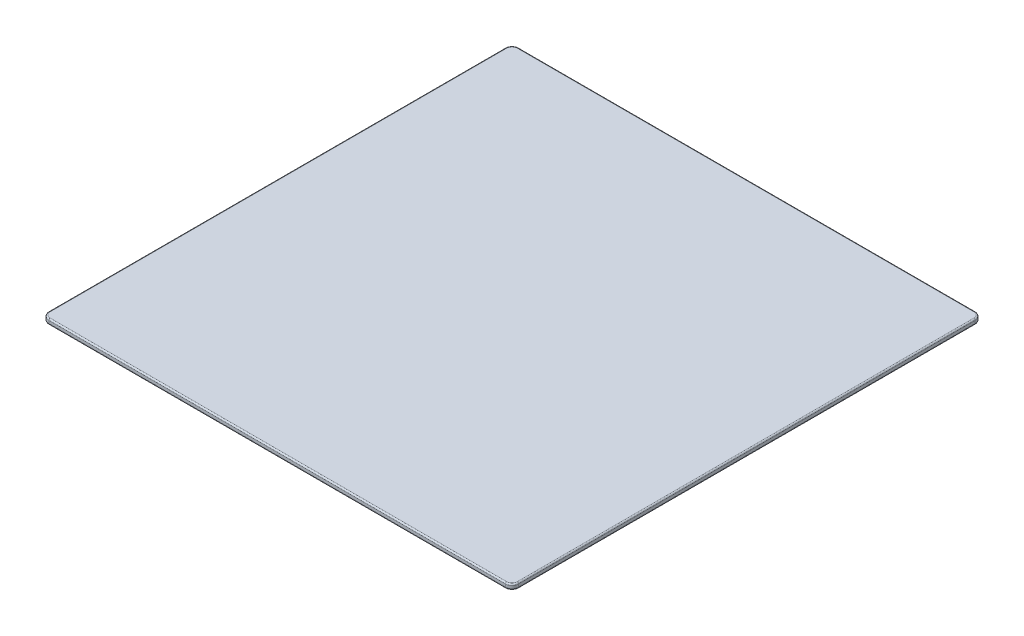
ISO-10303-21;
HEADER;
FILE_DESCRIPTION(('STEP AP214'),'2;1');
FILE_NAME('part.step','',(''),(''),'','','');
FILE_SCHEMA(('AUTOMOTIVE_DESIGN { 1 0 10303 214 1 1 1 1 }'));
ENDSEC;
DATA;
#1=APPLICATION_CONTEXT('core data for automotive mechanical design processes');
#2=APPLICATION_PROTOCOL_DEFINITION('international standard','automotive_design',2000,#1);
#3=PRODUCT_CONTEXT('',#1,'mechanical');
#4=PRODUCT('Part','Part','',(#3));
#5=PRODUCT_RELATED_PRODUCT_CATEGORY('part','',(#4));
#6=PRODUCT_DEFINITION_FORMATION('','',#4);
#7=PRODUCT_DEFINITION_CONTEXT('part definition',#1,'design');
#8=PRODUCT_DEFINITION('design','',#6,#7);
#9=PRODUCT_DEFINITION_SHAPE('','',#8);
#10=(LENGTH_UNIT() NAMED_UNIT(*) SI_UNIT(.MILLI.,.METRE.));
#11=(NAMED_UNIT(*) PLANE_ANGLE_UNIT() SI_UNIT($,.RADIAN.));
#12=(NAMED_UNIT(*) SI_UNIT($,.STERADIAN.) SOLID_ANGLE_UNIT());
#13=UNCERTAINTY_MEASURE_WITH_UNIT(LENGTH_MEASURE(1.E-05),#10,'distance_accuracy_value','');
#14=(GEOMETRIC_REPRESENTATION_CONTEXT(3) GLOBAL_UNCERTAINTY_ASSIGNED_CONTEXT((#13)) GLOBAL_UNIT_ASSIGNED_CONTEXT((#10,
#11,#12)) REPRESENTATION_CONTEXT('',''));
#15=CARTESIAN_POINT('',(0.,0.,0.));
#16=DIRECTION('',(0.,0.,1.));
#17=DIRECTION('',(1.,0.,0.));
#18=AXIS2_PLACEMENT_3D('',#15,#16,#17);
#19=CARTESIAN_POINT('',(170.,4.,170.));
#20=DIRECTION('',(0.,-1.,0.));
#21=DIRECTION('',(0.,0.,-1.));
#22=AXIS2_PLACEMENT_3D('',#19,#20,#21);
#23=CYLINDRICAL_SURFACE('',#22,5.00000000000006);
#24=DIRECTION('',(0.,-1.,0.));
#25=VECTOR('',#24,1.);
#26=CARTESIAN_POINT('',(170.,4.,175.));
#27=LINE('',#26,#25);
#28=CARTESIAN_POINT('',(170.,3.,175.));
#29=VERTEX_POINT('',#28);
#30=CARTESIAN_POINT('',(170.,1.,175.));
#31=VERTEX_POINT('',#30);
#32=EDGE_CURVE('E314',#29,#31,#27,.T.);
#33=ORIENTED_EDGE('',*,*,#32,.T.);
#34=CARTESIAN_POINT('',(170.,1.,170.));
#35=DIRECTION('',(0.,1.,0.));
#36=DIRECTION('',(0.,0.,1.));
#37=AXIS2_PLACEMENT_3D('',#34,#35,#36);
#38=CIRCLE('',#37,5.00000000000006);
#39=CARTESIAN_POINT('',(175.,1.,170.));
#40=VERTEX_POINT('',#39);
#41=EDGE_CURVE('E263',#31,#40,#38,.T.);
#42=ORIENTED_EDGE('',*,*,#41,.T.);
#43=DIRECTION('',(0.,-1.,0.));
#44=VECTOR('',#43,1.);
#45=CARTESIAN_POINT('',(175.,4.,170.));
#46=LINE('',#45,#44);
#47=CARTESIAN_POINT('',(175.,3.,170.));
#48=VERTEX_POINT('',#47);
#49=EDGE_CURVE('E178',#48,#40,#46,.T.);
#50=ORIENTED_EDGE('',*,*,#49,.F.);
#51=CARTESIAN_POINT('',(170.,3.,170.));
#52=DIRECTION('',(0.,1.,0.));
#53=DIRECTION('',(0.,0.,1.));
#54=AXIS2_PLACEMENT_3D('',#51,#52,#53);
#55=CIRCLE('',#54,5.00000000000006);
#56=EDGE_CURVE('E260',#48,#29,#55,.F.);
#57=ORIENTED_EDGE('',*,*,#56,.T.);
#58=EDGE_LOOP('',(#33,#42,#50,#57));
#59=FACE_BOUND('',#58,.T.);
#60=ADVANCED_FACE('F39',(#59),#23,.T.);
#61=CARTESIAN_POINT('',(175.,4.,-170.));
#62=DIRECTION('',(-1.,0.,0.));
#63=DIRECTION('',(0.,0.,1.));
#64=AXIS2_PLACEMENT_3D('',#61,#62,#63);
#65=PLANE('',#64);
#66=ORIENTED_EDGE('',*,*,#49,.T.);
#67=DIRECTION('',(0.,0.,-1.));
#68=VECTOR('',#67,1.);
#69=CARTESIAN_POINT('',(175.,1.,-170.));
#70=LINE('',#69,#68);
#71=CARTESIAN_POINT('',(175.,1.,-170.));
#72=VERTEX_POINT('',#71);
#73=EDGE_CURVE('E176',#40,#72,#70,.T.);
#74=ORIENTED_EDGE('',*,*,#73,.T.);
#75=DIRECTION('',(0.,-1.,0.));
#76=VECTOR('',#75,1.);
#77=CARTESIAN_POINT('',(175.,4.,-170.));
#78=LINE('',#77,#76);
#79=CARTESIAN_POINT('',(175.,3.,-170.));
#80=VERTEX_POINT('',#79);
#81=EDGE_CURVE('E157',#80,#72,#78,.T.);
#82=ORIENTED_EDGE('',*,*,#81,.F.);
#83=DIRECTION('',(0.,0.,-1.));
#84=VECTOR('',#83,1.);
#85=CARTESIAN_POINT('',(175.,3.,170.));
#86=LINE('',#85,#84);
#87=EDGE_CURVE('E173',#80,#48,#86,.F.);
#88=ORIENTED_EDGE('',*,*,#87,.T.);
#89=EDGE_LOOP('',(#66,#74,#82,#88));
#90=FACE_BOUND('',#89,.T.);
#91=ADVANCED_FACE('F171',(#90),#65,.F.);
#92=CARTESIAN_POINT('',(170.,4.,-170.));
#93=DIRECTION('',(0.,-1.,0.));
#94=DIRECTION('',(0.,0.,-1.));
#95=AXIS2_PLACEMENT_3D('',#92,#93,#94);
#96=CYLINDRICAL_SURFACE('',#95,5.00000000000002);
#97=ORIENTED_EDGE('',*,*,#81,.T.);
#98=CARTESIAN_POINT('',(170.,1.,-170.));
#99=DIRECTION('',(0.,1.,0.));
#100=DIRECTION('',(0.,0.,1.));
#101=AXIS2_PLACEMENT_3D('',#98,#99,#100);
#102=CIRCLE('',#101,5.00000000000002);
#103=CARTESIAN_POINT('',(170.,1.,-175.));
#104=VERTEX_POINT('',#103);
#105=EDGE_CURVE('E165',#72,#104,#102,.T.);
#106=ORIENTED_EDGE('',*,*,#105,.T.);
#107=DIRECTION('',(0.,-1.,0.));
#108=VECTOR('',#107,1.);
#109=CARTESIAN_POINT('',(170.,4.,-175.));
#110=LINE('',#109,#108);
#111=CARTESIAN_POINT('',(170.,3.,-175.));
#112=VERTEX_POINT('',#111);
#113=EDGE_CURVE('E159',#112,#104,#110,.T.);
#114=ORIENTED_EDGE('',*,*,#113,.F.);
#115=CARTESIAN_POINT('',(170.,3.,-170.));
#116=DIRECTION('',(0.,1.,0.));
#117=DIRECTION('',(0.,0.,1.));
#118=AXIS2_PLACEMENT_3D('',#115,#116,#117);
#119=CIRCLE('',#118,5.00000000000002);
#120=EDGE_CURVE('E154',#112,#80,#119,.F.);
#121=ORIENTED_EDGE('',*,*,#120,.T.);
#122=EDGE_LOOP('',(#97,#106,#114,#121));
#123=FACE_BOUND('',#122,.T.);
#124=ADVANCED_FACE('F156',(#123),#96,.T.);
#125=CARTESIAN_POINT('',(-170.,4.,-175.));
#126=DIRECTION('',(0.,0.,1.));
#127=DIRECTION('',(1.,0.,0.));
#128=AXIS2_PLACEMENT_3D('',#125,#126,#127);
#129=PLANE('',#128);
#130=ORIENTED_EDGE('',*,*,#113,.T.);
#131=DIRECTION('',(-1.,0.,0.));
#132=VECTOR('',#131,1.);
#133=CARTESIAN_POINT('',(-170.,1.,-175.));
#134=LINE('',#133,#132);
#135=CARTESIAN_POINT('',(-170.,1.,-175.));
#136=VERTEX_POINT('',#135);
#137=EDGE_CURVE('E232',#104,#136,#134,.T.);
#138=ORIENTED_EDGE('',*,*,#137,.T.);
#139=DIRECTION('',(0.,-1.,0.));
#140=VECTOR('',#139,1.);
#141=CARTESIAN_POINT('',(-170.,4.,-175.));
#142=LINE('',#141,#140);
#143=CARTESIAN_POINT('',(-170.,3.,-175.));
#144=VERTEX_POINT('',#143);
#145=EDGE_CURVE('E346',#144,#136,#142,.T.);
#146=ORIENTED_EDGE('',*,*,#145,.F.);
#147=DIRECTION('',(-1.,0.,0.));
#148=VECTOR('',#147,1.);
#149=CARTESIAN_POINT('',(170.,3.,-175.));
#150=LINE('',#149,#148);
#151=EDGE_CURVE('E229',#144,#112,#150,.F.);
#152=ORIENTED_EDGE('',*,*,#151,.T.);
#153=EDGE_LOOP('',(#130,#138,#146,#152));
#154=FACE_BOUND('',#153,.T.);
#155=ADVANCED_FACE('F343',(#154),#129,.F.);
#156=CARTESIAN_POINT('',(-170.,4.,-170.));
#157=DIRECTION('',(0.,-1.,0.));
#158=DIRECTION('',(0.,0.,-1.));
#159=AXIS2_PLACEMENT_3D('',#156,#157,#158);
#160=CYLINDRICAL_SURFACE('',#159,5.);
#161=ORIENTED_EDGE('',*,*,#145,.T.);
#162=CARTESIAN_POINT('',(-170.,1.,-170.));
#163=DIRECTION('',(0.,1.,0.));
#164=DIRECTION('',(0.,0.,1.));
#165=AXIS2_PLACEMENT_3D('',#162,#163,#164);
#166=CIRCLE('',#165,5.);
#167=CARTESIAN_POINT('',(-175.,1.,-170.));
#168=VERTEX_POINT('',#167);
#169=EDGE_CURVE('E238',#136,#168,#166,.T.);
#170=ORIENTED_EDGE('',*,*,#169,.T.);
#171=DIRECTION('',(0.,-1.,0.));
#172=VECTOR('',#171,1.);
#173=CARTESIAN_POINT('',(-175.,4.,-170.));
#174=LINE('',#173,#172);
#175=CARTESIAN_POINT('',(-175.,3.,-170.));
#176=VERTEX_POINT('',#175);
#177=EDGE_CURVE('E350',#176,#168,#174,.T.);
#178=ORIENTED_EDGE('',*,*,#177,.F.);
#179=CARTESIAN_POINT('',(-170.,3.,-170.));
#180=DIRECTION('',(0.,1.,0.));
#181=DIRECTION('',(0.,0.,1.));
#182=AXIS2_PLACEMENT_3D('',#179,#180,#181);
#183=CIRCLE('',#182,5.);
#184=EDGE_CURVE('E235',#176,#144,#183,.F.);
#185=ORIENTED_EDGE('',*,*,#184,.T.);
#186=EDGE_LOOP('',(#161,#170,#178,#185));
#187=FACE_BOUND('',#186,.T.);
#188=ADVANCED_FACE('F400',(#187),#160,.T.);
#189=CARTESIAN_POINT('',(-175.,4.,-170.));
#190=DIRECTION('',(1.,0.,0.));
#191=DIRECTION('',(0.,0.,-1.));
#192=AXIS2_PLACEMENT_3D('',#189,#190,#191);
#193=PLANE('',#192);
#194=ORIENTED_EDGE('',*,*,#177,.T.);
#195=DIRECTION('',(0.,0.,1.));
#196=VECTOR('',#195,1.);
#197=CARTESIAN_POINT('',(-175.,1.,-170.));
#198=LINE('',#197,#196);
#199=CARTESIAN_POINT('',(-175.,1.,170.));
#200=VERTEX_POINT('',#199);
#201=EDGE_CURVE('E244',#168,#200,#198,.T.);
#202=ORIENTED_EDGE('',*,*,#201,.T.);
#203=DIRECTION('',(0.,-1.,0.));
#204=VECTOR('',#203,1.);
#205=CARTESIAN_POINT('',(-175.,4.,170.));
#206=LINE('',#205,#204);
#207=CARTESIAN_POINT('',(-175.,3.,170.));
#208=VERTEX_POINT('',#207);
#209=EDGE_CURVE('E356',#208,#200,#206,.T.);
#210=ORIENTED_EDGE('',*,*,#209,.F.);
#211=DIRECTION('',(0.,0.,1.));
#212=VECTOR('',#211,1.);
#213=CARTESIAN_POINT('',(-175.,3.,-170.));
#214=LINE('',#213,#212);
#215=EDGE_CURVE('E241',#208,#176,#214,.F.);
#216=ORIENTED_EDGE('',*,*,#215,.T.);
#217=EDGE_LOOP('',(#194,#202,#210,#216));
#218=FACE_BOUND('',#217,.T.);
#219=ADVANCED_FACE('F403',(#218),#193,.F.);
#220=CARTESIAN_POINT('',(-170.,4.,170.));
#221=DIRECTION('',(0.,-1.,0.));
#222=DIRECTION('',(0.,0.,-1.));
#223=AXIS2_PLACEMENT_3D('',#220,#221,#222);
#224=CYLINDRICAL_SURFACE('',#223,5.00000000000002);
#225=ORIENTED_EDGE('',*,*,#209,.T.);
#226=CARTESIAN_POINT('',(-170.,1.,170.));
#227=DIRECTION('',(0.,1.,0.));
#228=DIRECTION('',(0.,0.,1.));
#229=AXIS2_PLACEMENT_3D('',#226,#227,#228);
#230=CIRCLE('',#229,5.00000000000002);
#231=CARTESIAN_POINT('',(-170.,1.,175.));
#232=VERTEX_POINT('',#231);
#233=EDGE_CURVE('E250',#200,#232,#230,.T.);
#234=ORIENTED_EDGE('',*,*,#233,.T.);
#235=DIRECTION('',(0.,-1.,0.));
#236=VECTOR('',#235,1.);
#237=CARTESIAN_POINT('',(-170.,4.,175.));
#238=LINE('',#237,#236);
#239=CARTESIAN_POINT('',(-170.,3.,175.));
#240=VERTEX_POINT('',#239);
#241=EDGE_CURVE('E362',#240,#232,#238,.T.);
#242=ORIENTED_EDGE('',*,*,#241,.F.);
#243=CARTESIAN_POINT('',(-170.,3.,170.));
#244=DIRECTION('',(0.,1.,0.));
#245=DIRECTION('',(0.,0.,1.));
#246=AXIS2_PLACEMENT_3D('',#243,#244,#245);
#247=CIRCLE('',#246,5.00000000000002);
#248=EDGE_CURVE('E247',#240,#208,#247,.F.);
#249=ORIENTED_EDGE('',*,*,#248,.T.);
#250=EDGE_LOOP('',(#225,#234,#242,#249));
#251=FACE_BOUND('',#250,.T.);
#252=ADVANCED_FACE('F417',(#251),#224,.T.);
#253=CARTESIAN_POINT('',(-170.,4.,175.));
#254=DIRECTION('',(0.,0.,-1.));
#255=DIRECTION('',(-1.,0.,0.));
#256=AXIS2_PLACEMENT_3D('',#253,#254,#255);
#257=PLANE('',#256);
#258=ORIENTED_EDGE('',*,*,#241,.T.);
#259=DIRECTION('',(1.,0.,0.));
#260=VECTOR('',#259,1.);
#261=CARTESIAN_POINT('',(-170.,1.,175.));
#262=LINE('',#261,#260);
#263=EDGE_CURVE('E257',#232,#31,#262,.T.);
#264=ORIENTED_EDGE('',*,*,#263,.T.);
#265=ORIENTED_EDGE('',*,*,#32,.F.);
#266=DIRECTION('',(1.,0.,0.));
#267=VECTOR('',#266,1.);
#268=CARTESIAN_POINT('',(-170.,3.,175.));
#269=LINE('',#268,#267);
#270=EDGE_CURVE('E253',#29,#240,#269,.F.);
#271=ORIENTED_EDGE('',*,*,#270,.T.);
#272=EDGE_LOOP('',(#258,#264,#265,#271));
#273=FACE_BOUND('',#272,.T.);
#274=ADVANCED_FACE('F418',(#273),#257,.F.);
#275=CARTESIAN_POINT('',(170.,4.,170.));
#276=DIRECTION('',(0.,1.,0.));
#277=DIRECTION('',(0.,0.,1.));
#278=AXIS2_PLACEMENT_3D('',#275,#276,#277);
#279=PLANE('',#278);
#280=CARTESIAN_POINT('',(-170.,4.,170.));
#281=DIRECTION('',(0.,1.,0.));
#282=DIRECTION('',(0.,0.,1.));
#283=AXIS2_PLACEMENT_3D('',#280,#281,#282);
#284=CIRCLE('',#283,4.00000000000002);
#285=CARTESIAN_POINT('',(-174.,4.,170.));
#286=VERTEX_POINT('',#285);
#287=CARTESIAN_POINT('',(-170.,4.,174.));
#288=VERTEX_POINT('',#287);
#289=EDGE_CURVE('E49',#286,#288,#284,.T.);
#290=ORIENTED_EDGE('',*,*,#289,.T.);
#291=DIRECTION('',(1.,0.,0.));
#292=VECTOR('',#291,1.);
#293=CARTESIAN_POINT('',(170.,4.,174.));
#294=LINE('',#293,#292);
#295=CARTESIAN_POINT('',(170.,4.,174.));
#296=VERTEX_POINT('',#295);
#297=EDGE_CURVE('E11',#288,#296,#294,.T.);
#298=ORIENTED_EDGE('',*,*,#297,.T.);
#299=CARTESIAN_POINT('',(170.,4.,170.));
#300=DIRECTION('',(0.,1.,0.));
#301=DIRECTION('',(0.,0.,1.));
#302=AXIS2_PLACEMENT_3D('',#299,#300,#301);
#303=CIRCLE('',#302,4.00000000000006);
#304=CARTESIAN_POINT('',(174.,4.,170.));
#305=VERTEX_POINT('',#304);
#306=EDGE_CURVE('E266',#296,#305,#303,.T.);
#307=ORIENTED_EDGE('',*,*,#306,.T.);
#308=DIRECTION('',(0.,0.,-1.));
#309=VECTOR('',#308,1.);
#310=CARTESIAN_POINT('',(174.,4.,-170.));
#311=LINE('',#310,#309);
#312=CARTESIAN_POINT('',(174.,4.,-170.));
#313=VERTEX_POINT('',#312);
#314=EDGE_CURVE('E269',#305,#313,#311,.T.);
#315=ORIENTED_EDGE('',*,*,#314,.T.);
#316=CARTESIAN_POINT('',(170.,4.,-170.));
#317=DIRECTION('',(0.,1.,0.));
#318=DIRECTION('',(0.,0.,1.));
#319=AXIS2_PLACEMENT_3D('',#316,#317,#318);
#320=CIRCLE('',#319,4.00000000000002);
#321=CARTESIAN_POINT('',(170.,4.,-174.));
#322=VERTEX_POINT('',#321);
#323=EDGE_CURVE('E184',#313,#322,#320,.T.);
#324=ORIENTED_EDGE('',*,*,#323,.T.);
#325=DIRECTION('',(-1.,0.,0.));
#326=VECTOR('',#325,1.);
#327=CARTESIAN_POINT('',(-170.,4.,-174.));
#328=LINE('',#327,#326);
#329=CARTESIAN_POINT('',(-170.,4.,-174.));
#330=VERTEX_POINT('',#329);
#331=EDGE_CURVE('E274',#322,#330,#328,.T.);
#332=ORIENTED_EDGE('',*,*,#331,.T.);
#333=CARTESIAN_POINT('',(-170.,4.,-170.));
#334=DIRECTION('',(0.,1.,0.));
#335=DIRECTION('',(0.,0.,1.));
#336=AXIS2_PLACEMENT_3D('',#333,#334,#335);
#337=CIRCLE('',#336,4.);
#338=CARTESIAN_POINT('',(-174.,4.,-170.));
#339=VERTEX_POINT('',#338);
#340=EDGE_CURVE('E277',#330,#339,#337,.T.);
#341=ORIENTED_EDGE('',*,*,#340,.T.);
#342=DIRECTION('',(0.,0.,1.));
#343=VECTOR('',#342,1.);
#344=CARTESIAN_POINT('',(-174.,4.,170.));
#345=LINE('',#344,#343);
#346=EDGE_CURVE('E60',#339,#286,#345,.T.);
#347=ORIENTED_EDGE('',*,*,#346,.T.);
#348=EDGE_LOOP('',(#290,#298,#307,#315,#324,#332,#341,#347));
#349=FACE_BOUND('',#348,.T.);
#350=ADVANCED_FACE('F427',(#349),#279,.T.);
#351=CARTESIAN_POINT('',(170.,0.,170.));
#352=DIRECTION('',(0.,1.,0.));
#353=DIRECTION('',(0.,0.,1.));
#354=AXIS2_PLACEMENT_3D('',#351,#352,#353);
#355=PLANE('',#354);
#356=CARTESIAN_POINT('',(170.,0.,-170.));
#357=DIRECTION('',(0.,1.,0.));
#358=DIRECTION('',(0.,0.,1.));
#359=AXIS2_PLACEMENT_3D('',#356,#357,#358);
#360=CIRCLE('',#359,4.00000000000002);
#361=CARTESIAN_POINT('',(170.,0.,-174.));
#362=VERTEX_POINT('',#361);
#363=CARTESIAN_POINT('',(174.,0.,-170.));
#364=VERTEX_POINT('',#363);
#365=EDGE_CURVE('E221',#362,#364,#360,.F.);
#366=ORIENTED_EDGE('',*,*,#365,.T.);
#367=DIRECTION('',(0.,0.,-1.));
#368=VECTOR('',#367,1.);
#369=CARTESIAN_POINT('',(174.,0.,170.));
#370=LINE('',#369,#368);
#371=CARTESIAN_POINT('',(174.,0.,170.));
#372=VERTEX_POINT('',#371);
#373=EDGE_CURVE('E166',#364,#372,#370,.F.);
#374=ORIENTED_EDGE('',*,*,#373,.T.);
#375=CARTESIAN_POINT('',(170.,0.,170.));
#376=DIRECTION('',(0.,1.,0.));
#377=DIRECTION('',(0.,0.,1.));
#378=AXIS2_PLACEMENT_3D('',#375,#376,#377);
#379=CIRCLE('',#378,4.00000000000006);
#380=CARTESIAN_POINT('',(170.,0.,174.));
#381=VERTEX_POINT('',#380);
#382=EDGE_CURVE('E200',#372,#381,#379,.F.);
#383=ORIENTED_EDGE('',*,*,#382,.T.);
#384=DIRECTION('',(1.,0.,0.));
#385=VECTOR('',#384,1.);
#386=CARTESIAN_POINT('',(170.,0.,174.));
#387=LINE('',#386,#385);
#388=CARTESIAN_POINT('',(-170.,0.,174.));
#389=VERTEX_POINT('',#388);
#390=EDGE_CURVE('E206',#381,#389,#387,.F.);
#391=ORIENTED_EDGE('',*,*,#390,.T.);
#392=CARTESIAN_POINT('',(-170.,0.,170.));
#393=DIRECTION('',(0.,1.,0.));
#394=DIRECTION('',(0.,0.,1.));
#395=AXIS2_PLACEMENT_3D('',#392,#393,#394);
#396=CIRCLE('',#395,4.00000000000002);
#397=CARTESIAN_POINT('',(-174.,0.,170.));
#398=VERTEX_POINT('',#397);
#399=EDGE_CURVE('E209',#389,#398,#396,.F.);
#400=ORIENTED_EDGE('',*,*,#399,.T.);
#401=DIRECTION('',(0.,0.,1.));
#402=VECTOR('',#401,1.);
#403=CARTESIAN_POINT('',(-174.,0.,170.));
#404=LINE('',#403,#402);
#405=CARTESIAN_POINT('',(-174.,0.,-170.));
#406=VERTEX_POINT('',#405);
#407=EDGE_CURVE('E212',#398,#406,#404,.F.);
#408=ORIENTED_EDGE('',*,*,#407,.T.);
#409=CARTESIAN_POINT('',(-170.,0.,-170.));
#410=DIRECTION('',(0.,1.,0.));
#411=DIRECTION('',(0.,0.,1.));
#412=AXIS2_PLACEMENT_3D('',#409,#410,#411);
#413=CIRCLE('',#412,4.);
#414=CARTESIAN_POINT('',(-170.,0.,-174.));
#415=VERTEX_POINT('',#414);
#416=EDGE_CURVE('E215',#406,#415,#413,.F.);
#417=ORIENTED_EDGE('',*,*,#416,.T.);
#418=DIRECTION('',(-1.,0.,0.));
#419=VECTOR('',#418,1.);
#420=CARTESIAN_POINT('',(170.,0.,-174.));
#421=LINE('',#420,#419);
#422=EDGE_CURVE('E218',#415,#362,#421,.F.);
#423=ORIENTED_EDGE('',*,*,#422,.T.);
#424=EDGE_LOOP('',(#366,#374,#383,#391,#400,#408,#417,#423));
#425=FACE_BOUND('',#424,.T.);
#426=ADVANCED_FACE('F429',(#425),#355,.F.);
#427=CARTESIAN_POINT('',(-174.,1.,-170.));
#428=DIRECTION('',(0.,0.,1.));
#429=DIRECTION('',(1.,0.,0.));
#430=AXIS2_PLACEMENT_3D('',#427,#428,#429);
#431=CYLINDRICAL_SURFACE('',#430,1.);
#432=CARTESIAN_POINT('',(-174.,1.,-170.));
#433=DIRECTION('',(0.,0.,-1.));
#434=DIRECTION('',(-1.,0.,0.));
#435=AXIS2_PLACEMENT_3D('',#432,#433,#434);
#436=CIRCLE('',#435,1.);
#437=EDGE_CURVE('E306',#406,#168,#436,.T.);
#438=ORIENTED_EDGE('',*,*,#437,.F.);
#439=ORIENTED_EDGE('',*,*,#407,.F.);
#440=CARTESIAN_POINT('',(-174.,1.,170.));
#441=DIRECTION('',(0.,0.,1.));
#442=DIRECTION('',(1.,0.,0.));
#443=AXIS2_PLACEMENT_3D('',#440,#441,#442);
#444=CIRCLE('',#443,1.);
#445=EDGE_CURVE('E310',#200,#398,#444,.T.);
#446=ORIENTED_EDGE('',*,*,#445,.F.);
#447=ORIENTED_EDGE('',*,*,#201,.F.);
#448=EDGE_LOOP('',(#438,#439,#446,#447));
#449=FACE_BOUND('',#448,.T.);
#450=ADVANCED_FACE('F408',(#449),#431,.T.);
#451=CARTESIAN_POINT('',(-170.,1.,170.));
#452=DIRECTION('',(0.,1.,0.));
#453=DIRECTION('',(0.,0.,1.));
#454=AXIS2_PLACEMENT_3D('',#451,#452,#453);
#455=TOROIDAL_SURFACE('',#454,4.00000000000002,1.);
#456=ORIENTED_EDGE('',*,*,#445,.T.);
#457=ORIENTED_EDGE('',*,*,#399,.F.);
#458=CARTESIAN_POINT('',(-170.,1.,174.));
#459=DIRECTION('',(1.,0.,0.));
#460=DIRECTION('',(0.,0.,-1.));
#461=AXIS2_PLACEMENT_3D('',#458,#459,#460);
#462=CIRCLE('',#461,1.);
#463=EDGE_CURVE('E302',#232,#389,#462,.T.);
#464=ORIENTED_EDGE('',*,*,#463,.F.);
#465=ORIENTED_EDGE('',*,*,#233,.F.);
#466=EDGE_LOOP('',(#456,#457,#464,#465));
#467=FACE_BOUND('',#466,.T.);
#468=ADVANCED_FACE('F414',(#467),#455,.T.);
#469=CARTESIAN_POINT('',(-170.,1.,-170.));
#470=DIRECTION('',(0.,1.,0.));
#471=DIRECTION('',(0.,0.,1.));
#472=AXIS2_PLACEMENT_3D('',#469,#470,#471);
#473=TOROIDAL_SURFACE('',#472,4.,1.);
#474=ORIENTED_EDGE('',*,*,#437,.T.);
#475=ORIENTED_EDGE('',*,*,#169,.F.);
#476=CARTESIAN_POINT('',(-170.,1.,-174.));
#477=DIRECTION('',(1.,0.,0.));
#478=DIRECTION('',(0.,0.,-1.));
#479=AXIS2_PLACEMENT_3D('',#476,#477,#478);
#480=CIRCLE('',#479,1.);
#481=EDGE_CURVE('E298',#415,#136,#480,.T.);
#482=ORIENTED_EDGE('',*,*,#481,.F.);
#483=ORIENTED_EDGE('',*,*,#416,.F.);
#484=EDGE_LOOP('',(#474,#475,#482,#483));
#485=FACE_BOUND('',#484,.T.);
#486=ADVANCED_FACE('F397',(#485),#473,.T.);
#487=CARTESIAN_POINT('',(-170.,1.,174.));
#488=DIRECTION('',(1.,0.,0.));
#489=DIRECTION('',(0.,0.,-1.));
#490=AXIS2_PLACEMENT_3D('',#487,#488,#489);
#491=CYLINDRICAL_SURFACE('',#490,1.);
#492=ORIENTED_EDGE('',*,*,#463,.T.);
#493=ORIENTED_EDGE('',*,*,#390,.F.);
#494=CARTESIAN_POINT('',(170.,1.,174.));
#495=DIRECTION('',(1.,0.,0.));
#496=DIRECTION('',(0.,0.,-1.));
#497=AXIS2_PLACEMENT_3D('',#494,#495,#496);
#498=CIRCLE('',#497,1.);
#499=EDGE_CURVE('E294',#31,#381,#498,.T.);
#500=ORIENTED_EDGE('',*,*,#499,.F.);
#501=ORIENTED_EDGE('',*,*,#263,.F.);
#502=EDGE_LOOP('',(#492,#493,#500,#501));
#503=FACE_BOUND('',#502,.T.);
#504=ADVANCED_FACE('F377',(#503),#491,.T.);
#505=CARTESIAN_POINT('',(-170.,1.,-174.));
#506=DIRECTION('',(-1.,0.,0.));
#507=DIRECTION('',(0.,0.,1.));
#508=AXIS2_PLACEMENT_3D('',#505,#506,#507);
#509=CYLINDRICAL_SURFACE('',#508,1.);
#510=ORIENTED_EDGE('',*,*,#481,.T.);
#511=ORIENTED_EDGE('',*,*,#137,.F.);
#512=CARTESIAN_POINT('',(170.,1.,-174.));
#513=DIRECTION('',(1.,0.,0.));
#514=DIRECTION('',(0.,0.,-1.));
#515=AXIS2_PLACEMENT_3D('',#512,#513,#514);
#516=CIRCLE('',#515,1.);
#517=EDGE_CURVE('E290',#362,#104,#516,.T.);
#518=ORIENTED_EDGE('',*,*,#517,.F.);
#519=ORIENTED_EDGE('',*,*,#422,.F.);
#520=EDGE_LOOP('',(#510,#511,#518,#519));
#521=FACE_BOUND('',#520,.T.);
#522=ADVANCED_FACE('F393',(#521),#509,.T.);
#523=CARTESIAN_POINT('',(170.,1.,170.));
#524=DIRECTION('',(0.,1.,0.));
#525=DIRECTION('',(0.,0.,1.));
#526=AXIS2_PLACEMENT_3D('',#523,#524,#525);
#527=TOROIDAL_SURFACE('',#526,4.00000000000006,1.);
#528=ORIENTED_EDGE('',*,*,#499,.T.);
#529=ORIENTED_EDGE('',*,*,#382,.F.);
#530=CARTESIAN_POINT('',(174.,1.,170.));
#531=DIRECTION('',(0.,0.,-1.));
#532=DIRECTION('',(-1.,0.,0.));
#533=AXIS2_PLACEMENT_3D('',#530,#531,#532);
#534=CIRCLE('',#533,1.);
#535=EDGE_CURVE('E287',#40,#372,#534,.T.);
#536=ORIENTED_EDGE('',*,*,#535,.F.);
#537=ORIENTED_EDGE('',*,*,#41,.F.);
#538=EDGE_LOOP('',(#528,#529,#536,#537));
#539=FACE_BOUND('',#538,.T.);
#540=ADVANCED_FACE('F381',(#539),#527,.T.);
#541=CARTESIAN_POINT('',(170.,1.,-170.));
#542=DIRECTION('',(0.,1.,0.));
#543=DIRECTION('',(0.,0.,1.));
#544=AXIS2_PLACEMENT_3D('',#541,#542,#543);
#545=TOROIDAL_SURFACE('',#544,4.00000000000002,1.);
#546=ORIENTED_EDGE('',*,*,#517,.T.);
#547=ORIENTED_EDGE('',*,*,#105,.F.);
#548=CARTESIAN_POINT('',(174.,1.,-170.));
#549=DIRECTION('',(0.,0.,1.));
#550=DIRECTION('',(1.,0.,0.));
#551=AXIS2_PLACEMENT_3D('',#548,#549,#550);
#552=CIRCLE('',#551,1.);
#553=EDGE_CURVE('E284',#364,#72,#552,.T.);
#554=ORIENTED_EDGE('',*,*,#553,.F.);
#555=ORIENTED_EDGE('',*,*,#365,.F.);
#556=EDGE_LOOP('',(#546,#547,#554,#555));
#557=FACE_BOUND('',#556,.T.);
#558=ADVANCED_FACE('F389',(#557),#545,.T.);
#559=CARTESIAN_POINT('',(174.,1.,-170.));
#560=DIRECTION('',(0.,0.,-1.));
#561=DIRECTION('',(-1.,0.,0.));
#562=AXIS2_PLACEMENT_3D('',#559,#560,#561);
#563=CYLINDRICAL_SURFACE('',#562,1.);
#564=ORIENTED_EDGE('',*,*,#535,.T.);
#565=ORIENTED_EDGE('',*,*,#373,.F.);
#566=ORIENTED_EDGE('',*,*,#553,.T.);
#567=ORIENTED_EDGE('',*,*,#73,.F.);
#568=EDGE_LOOP('',(#564,#565,#566,#567));
#569=FACE_BOUND('',#568,.T.);
#570=ADVANCED_FACE('F384',(#569),#563,.T.);
#571=CARTESIAN_POINT('',(170.,3.,-174.));
#572=DIRECTION('',(1.,0.,0.));
#573=DIRECTION('',(0.,0.,-1.));
#574=AXIS2_PLACEMENT_3D('',#571,#572,#573);
#575=CYLINDRICAL_SURFACE('',#574,1.);
#576=CARTESIAN_POINT('',(170.,3.,-174.));
#577=DIRECTION('',(1.,0.,0.));
#578=DIRECTION('',(0.,0.,-1.));
#579=AXIS2_PLACEMENT_3D('',#576,#577,#578);
#580=CIRCLE('',#579,1.);
#581=EDGE_CURVE('E328',#112,#322,#580,.T.);
#582=ORIENTED_EDGE('',*,*,#581,.F.);
#583=ORIENTED_EDGE('',*,*,#151,.F.);
#584=CARTESIAN_POINT('',(-170.,3.,-174.));
#585=DIRECTION('',(-1.,0.,0.));
#586=DIRECTION('',(0.,0.,1.));
#587=AXIS2_PLACEMENT_3D('',#584,#585,#586);
#588=CIRCLE('',#587,1.);
#589=EDGE_CURVE('E43',#330,#144,#588,.T.);
#590=ORIENTED_EDGE('',*,*,#589,.F.);
#591=ORIENTED_EDGE('',*,*,#331,.F.);
#592=EDGE_LOOP('',(#582,#583,#590,#591));
#593=FACE_BOUND('',#592,.T.);
#594=ADVANCED_FACE('F41',(#593),#575,.T.);
#595=CARTESIAN_POINT('',(-170.,3.,-170.));
#596=DIRECTION('',(0.,1.,0.));
#597=DIRECTION('',(0.,0.,1.));
#598=AXIS2_PLACEMENT_3D('',#595,#596,#597);
#599=TOROIDAL_SURFACE('',#598,4.,1.);
#600=ORIENTED_EDGE('',*,*,#589,.T.);
#601=ORIENTED_EDGE('',*,*,#184,.F.);
#602=CARTESIAN_POINT('',(-174.,3.,-170.));
#603=DIRECTION('',(0.,0.,1.));
#604=DIRECTION('',(1.,0.,0.));
#605=AXIS2_PLACEMENT_3D('',#602,#603,#604);
#606=CIRCLE('',#605,1.);
#607=EDGE_CURVE('E188',#339,#176,#606,.T.);
#608=ORIENTED_EDGE('',*,*,#607,.F.);
#609=ORIENTED_EDGE('',*,*,#340,.F.);
#610=EDGE_LOOP('',(#600,#601,#608,#609));
#611=FACE_BOUND('',#610,.T.);
#612=ADVANCED_FACE('F336',(#611),#599,.T.);
#613=CARTESIAN_POINT('',(170.,3.,-170.));
#614=DIRECTION('',(0.,1.,0.));
#615=DIRECTION('',(0.,0.,1.));
#616=AXIS2_PLACEMENT_3D('',#613,#614,#615);
#617=TOROIDAL_SURFACE('',#616,4.00000000000002,1.);
#618=ORIENTED_EDGE('',*,*,#581,.T.);
#619=ORIENTED_EDGE('',*,*,#323,.F.);
#620=CARTESIAN_POINT('',(174.,3.,-170.));
#621=DIRECTION('',(0.,0.,1.));
#622=DIRECTION('',(1.,0.,0.));
#623=AXIS2_PLACEMENT_3D('',#620,#621,#622);
#624=CIRCLE('',#623,1.);
#625=EDGE_CURVE('E182',#80,#313,#624,.T.);
#626=ORIENTED_EDGE('',*,*,#625,.F.);
#627=ORIENTED_EDGE('',*,*,#120,.F.);
#628=EDGE_LOOP('',(#618,#619,#626,#627));
#629=FACE_BOUND('',#628,.T.);
#630=ADVANCED_FACE('F183',(#629),#617,.T.);
#631=CARTESIAN_POINT('',(-174.,3.,170.));
#632=DIRECTION('',(0.,0.,-1.));
#633=DIRECTION('',(-1.,0.,0.));
#634=AXIS2_PLACEMENT_3D('',#631,#632,#633);
#635=CYLINDRICAL_SURFACE('',#634,1.);
#636=ORIENTED_EDGE('',*,*,#607,.T.);
#637=ORIENTED_EDGE('',*,*,#215,.F.);
#638=CARTESIAN_POINT('',(-174.,3.,170.));
#639=DIRECTION('',(0.,0.,1.));
#640=DIRECTION('',(1.,0.,0.));
#641=AXIS2_PLACEMENT_3D('',#638,#639,#640);
#642=CIRCLE('',#641,1.);
#643=EDGE_CURVE('E189',#286,#208,#642,.T.);
#644=ORIENTED_EDGE('',*,*,#643,.F.);
#645=ORIENTED_EDGE('',*,*,#346,.F.);
#646=EDGE_LOOP('',(#636,#637,#644,#645));
#647=FACE_BOUND('',#646,.T.);
#648=ADVANCED_FACE('F472',(#647),#635,.T.);
#649=CARTESIAN_POINT('',(174.,3.,170.));
#650=DIRECTION('',(0.,0.,1.));
#651=DIRECTION('',(1.,0.,0.));
#652=AXIS2_PLACEMENT_3D('',#649,#650,#651);
#653=CYLINDRICAL_SURFACE('',#652,1.);
#654=ORIENTED_EDGE('',*,*,#625,.T.);
#655=ORIENTED_EDGE('',*,*,#314,.F.);
#656=CARTESIAN_POINT('',(174.,3.,170.));
#657=DIRECTION('',(0.,0.,1.));
#658=DIRECTION('',(1.,0.,0.));
#659=AXIS2_PLACEMENT_3D('',#656,#657,#658);
#660=CIRCLE('',#659,1.);
#661=EDGE_CURVE('E194',#48,#305,#660,.T.);
#662=ORIENTED_EDGE('',*,*,#661,.F.);
#663=ORIENTED_EDGE('',*,*,#87,.F.);
#664=EDGE_LOOP('',(#654,#655,#662,#663));
#665=FACE_BOUND('',#664,.T.);
#666=ADVANCED_FACE('F192',(#665),#653,.T.);
#667=CARTESIAN_POINT('',(-170.,3.,170.));
#668=DIRECTION('',(0.,1.,0.));
#669=DIRECTION('',(0.,0.,1.));
#670=AXIS2_PLACEMENT_3D('',#667,#668,#669);
#671=TOROIDAL_SURFACE('',#670,4.00000000000002,1.);
#672=ORIENTED_EDGE('',*,*,#643,.T.);
#673=ORIENTED_EDGE('',*,*,#248,.F.);
#674=CARTESIAN_POINT('',(-170.,3.,174.));
#675=DIRECTION('',(1.,0.,0.));
#676=DIRECTION('',(0.,0.,-1.));
#677=AXIS2_PLACEMENT_3D('',#674,#675,#676);
#678=CIRCLE('',#677,1.);
#679=EDGE_CURVE('E318',#288,#240,#678,.T.);
#680=ORIENTED_EDGE('',*,*,#679,.F.);
#681=ORIENTED_EDGE('',*,*,#289,.F.);
#682=EDGE_LOOP('',(#672,#673,#680,#681));
#683=FACE_BOUND('',#682,.T.);
#684=ADVANCED_FACE('F466',(#683),#671,.T.);
#685=CARTESIAN_POINT('',(170.,3.,170.));
#686=DIRECTION('',(0.,1.,0.));
#687=DIRECTION('',(0.,0.,1.));
#688=AXIS2_PLACEMENT_3D('',#685,#686,#687);
#689=TOROIDAL_SURFACE('',#688,4.00000000000006,1.);
#690=ORIENTED_EDGE('',*,*,#661,.T.);
#691=ORIENTED_EDGE('',*,*,#306,.F.);
#692=CARTESIAN_POINT('',(170.,3.,174.));
#693=DIRECTION('',(-1.,0.,0.));
#694=DIRECTION('',(0.,0.,1.));
#695=AXIS2_PLACEMENT_3D('',#692,#693,#694);
#696=CIRCLE('',#695,1.);
#697=EDGE_CURVE('E315',#29,#296,#696,.T.);
#698=ORIENTED_EDGE('',*,*,#697,.F.);
#699=ORIENTED_EDGE('',*,*,#56,.F.);
#700=EDGE_LOOP('',(#690,#691,#698,#699));
#701=FACE_BOUND('',#700,.T.);
#702=ADVANCED_FACE('F426',(#701),#689,.T.);
#703=CARTESIAN_POINT('',(170.,3.,174.));
#704=DIRECTION('',(-1.,0.,0.));
#705=DIRECTION('',(0.,0.,1.));
#706=AXIS2_PLACEMENT_3D('',#703,#704,#705);
#707=CYLINDRICAL_SURFACE('',#706,1.);
#708=ORIENTED_EDGE('',*,*,#679,.T.);
#709=ORIENTED_EDGE('',*,*,#270,.F.);
#710=ORIENTED_EDGE('',*,*,#697,.T.);
#711=ORIENTED_EDGE('',*,*,#297,.F.);
#712=EDGE_LOOP('',(#708,#709,#710,#711));
#713=FACE_BOUND('',#712,.T.);
#714=ADVANCED_FACE('F421',(#713),#707,.T.);
#715=CLOSED_SHELL('',(#60,#91,#124,#155,#188,#219,#252,#274,#350,#426,#450,#468,#486,#504,#522,
#540,#558,#570,#594,#612,#630,#648,#666,#684,#702,#714));
#716=MANIFOLD_SOLID_BREP('B2',#715);
#717=ADVANCED_BREP_SHAPE_REPRESENTATION('',(#18,#716),#14);
#718=SHAPE_DEFINITION_REPRESENTATION(#9,#717);
ENDSEC;
END-ISO-10303-21;
